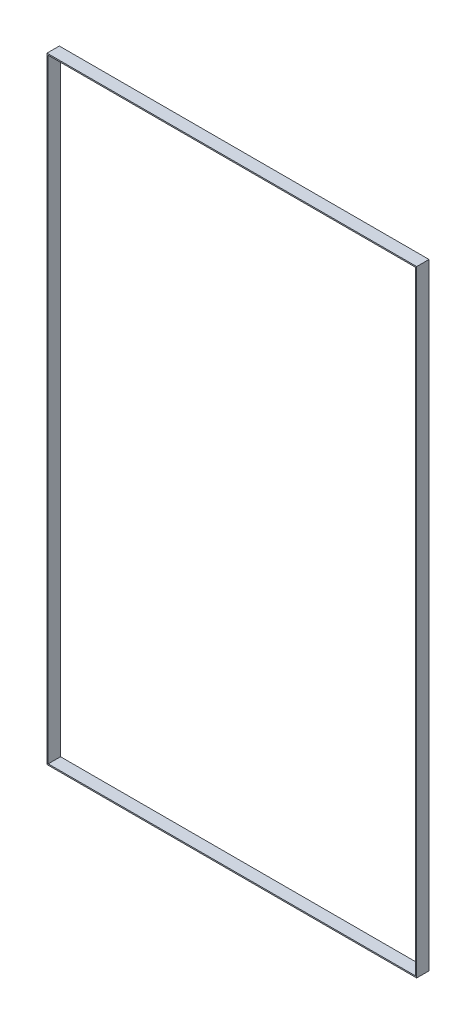
ISO-10303-21;
HEADER;
FILE_DESCRIPTION(('STEP AP214'),'2;1');
FILE_NAME('part.step','',(''),(''),'','','');
FILE_SCHEMA(('AUTOMOTIVE_DESIGN { 1 0 10303 214 1 1 1 1 }'));
ENDSEC;
DATA;
#1=APPLICATION_CONTEXT('core data for automotive mechanical design processes');
#2=APPLICATION_PROTOCOL_DEFINITION('international standard','automotive_design',2000,#1);
#3=PRODUCT_CONTEXT('',#1,'mechanical');
#4=PRODUCT('Part','Part','',(#3));
#5=PRODUCT_RELATED_PRODUCT_CATEGORY('part','',(#4));
#6=PRODUCT_DEFINITION_FORMATION('','',#4);
#7=PRODUCT_DEFINITION_CONTEXT('part definition',#1,'design');
#8=PRODUCT_DEFINITION('design','',#6,#7);
#9=PRODUCT_DEFINITION_SHAPE('','',#8);
#10=(LENGTH_UNIT() NAMED_UNIT(*) SI_UNIT(.MILLI.,.METRE.));
#11=(NAMED_UNIT(*) PLANE_ANGLE_UNIT() SI_UNIT($,.RADIAN.));
#12=(NAMED_UNIT(*) SI_UNIT($,.STERADIAN.) SOLID_ANGLE_UNIT());
#13=UNCERTAINTY_MEASURE_WITH_UNIT(LENGTH_MEASURE(1.E-05),#10,'distance_accuracy_value','');
#14=(GEOMETRIC_REPRESENTATION_CONTEXT(3) GLOBAL_UNCERTAINTY_ASSIGNED_CONTEXT((#13)) GLOBAL_UNIT_ASSIGNED_CONTEXT((#10,
#11,#12)) REPRESENTATION_CONTEXT('',''));
#15=CARTESIAN_POINT('',(0.,0.,0.));
#16=DIRECTION('',(0.,0.,1.));
#17=DIRECTION('',(1.,0.,0.));
#18=AXIS2_PLACEMENT_3D('',#15,#16,#17);
#19=CARTESIAN_POINT('',(0.,0.,20.));
#20=DIRECTION('',(0.,0.,1.));
#21=DIRECTION('',(1.,0.,0.));
#22=AXIS2_PLACEMENT_3D('',#19,#20,#21);
#23=PLANE('',#22);
#24=DIRECTION('',(0.,-1.,0.));
#25=VECTOR('',#24,1.);
#26=CARTESIAN_POINT('',(-300.,-500.,20.));
#27=LINE('',#26,#25);
#28=CARTESIAN_POINT('',(-300.,500.,20.));
#29=VERTEX_POINT('',#28);
#30=CARTESIAN_POINT('',(-300.,-500.,20.));
#31=VERTEX_POINT('',#30);
#32=EDGE_CURVE('E134',#29,#31,#27,.T.);
#33=ORIENTED_EDGE('',*,*,#32,.T.);
#34=DIRECTION('',(1.,0.,0.));
#35=VECTOR('',#34,1.);
#36=CARTESIAN_POINT('',(300.,-500.,20.));
#37=LINE('',#36,#35);
#38=CARTESIAN_POINT('',(300.,-500.,20.));
#39=VERTEX_POINT('',#38);
#40=EDGE_CURVE('E137',#31,#39,#37,.T.);
#41=ORIENTED_EDGE('',*,*,#40,.T.);
#42=DIRECTION('',(0.,1.,0.));
#43=VECTOR('',#42,1.);
#44=CARTESIAN_POINT('',(300.,-500.,20.));
#45=LINE('',#44,#43);
#46=CARTESIAN_POINT('',(300.,500.,20.));
#47=VERTEX_POINT('',#46);
#48=EDGE_CURVE('E140',#39,#47,#45,.T.);
#49=ORIENTED_EDGE('',*,*,#48,.T.);
#50=DIRECTION('',(-1.,0.,0.));
#51=VECTOR('',#50,1.);
#52=CARTESIAN_POINT('',(300.,500.,20.));
#53=LINE('',#52,#51);
#54=EDGE_CURVE('E142',#47,#29,#53,.T.);
#55=ORIENTED_EDGE('',*,*,#54,.T.);
#56=EDGE_LOOP('',(#33,#41,#49,#55));
#57=FACE_BOUND('',#56,.T.);
#58=DIRECTION('',(1.,0.,0.));
#59=VECTOR('',#58,1.);
#60=CARTESIAN_POINT('',(298.,-498.,20.));
#61=LINE('',#60,#59);
#62=CARTESIAN_POINT('',(-298.,-498.,20.));
#63=VERTEX_POINT('',#62);
#64=CARTESIAN_POINT('',(298.,-498.,20.));
#65=VERTEX_POINT('',#64);
#66=EDGE_CURVE('E106',#63,#65,#61,.T.);
#67=ORIENTED_EDGE('',*,*,#66,.F.);
#68=DIRECTION('',(0.,-1.,0.));
#69=VECTOR('',#68,1.);
#70=CARTESIAN_POINT('',(-298.,-498.,20.));
#71=LINE('',#70,#69);
#72=CARTESIAN_POINT('',(-298.,498.,20.));
#73=VERTEX_POINT('',#72);
#74=EDGE_CURVE('E98',#73,#63,#71,.T.);
#75=ORIENTED_EDGE('',*,*,#74,.F.);
#76=DIRECTION('',(-1.,0.,0.));
#77=VECTOR('',#76,1.);
#78=CARTESIAN_POINT('',(298.,498.,20.));
#79=LINE('',#78,#77);
#80=CARTESIAN_POINT('',(298.,498.,20.));
#81=VERTEX_POINT('',#80);
#82=EDGE_CURVE('E120',#81,#73,#79,.T.);
#83=ORIENTED_EDGE('',*,*,#82,.F.);
#84=DIRECTION('',(0.,1.,0.));
#85=VECTOR('',#84,1.);
#86=CARTESIAN_POINT('',(298.,-498.,20.));
#87=LINE('',#86,#85);
#88=EDGE_CURVE('E118',#65,#81,#87,.T.);
#89=ORIENTED_EDGE('',*,*,#88,.F.);
#90=EDGE_LOOP('',(#67,#75,#83,#89));
#91=FACE_BOUND('',#90,.T.);
#92=ADVANCED_FACE('F33',(#57,#91),#23,.T.);
#93=CARTESIAN_POINT('',(0.,0.,0.));
#94=DIRECTION('',(0.,0.,1.));
#95=DIRECTION('',(1.,0.,0.));
#96=AXIS2_PLACEMENT_3D('',#93,#94,#95);
#97=PLANE('',#96);
#98=DIRECTION('',(0.,-1.,0.));
#99=VECTOR('',#98,1.);
#100=CARTESIAN_POINT('',(-300.,-500.,0.));
#101=LINE('',#100,#99);
#102=CARTESIAN_POINT('',(-300.,500.,0.));
#103=VERTEX_POINT('',#102);
#104=CARTESIAN_POINT('',(-300.,-500.,0.));
#105=VERTEX_POINT('',#104);
#106=EDGE_CURVE('E114',#103,#105,#101,.T.);
#107=ORIENTED_EDGE('',*,*,#106,.F.);
#108=DIRECTION('',(-1.,0.,0.));
#109=VECTOR('',#108,1.);
#110=CARTESIAN_POINT('',(300.,500.,0.));
#111=LINE('',#110,#109);
#112=CARTESIAN_POINT('',(300.,500.,0.));
#113=VERTEX_POINT('',#112);
#114=EDGE_CURVE('E138',#113,#103,#111,.T.);
#115=ORIENTED_EDGE('',*,*,#114,.F.);
#116=DIRECTION('',(0.,1.,0.));
#117=VECTOR('',#116,1.);
#118=CARTESIAN_POINT('',(300.,-500.,0.));
#119=LINE('',#118,#117);
#120=CARTESIAN_POINT('',(300.,-500.,0.));
#121=VERTEX_POINT('',#120);
#122=EDGE_CURVE('E149',#121,#113,#119,.T.);
#123=ORIENTED_EDGE('',*,*,#122,.F.);
#124=DIRECTION('',(1.,0.,0.));
#125=VECTOR('',#124,1.);
#126=CARTESIAN_POINT('',(300.,-500.,0.));
#127=LINE('',#126,#125);
#128=EDGE_CURVE('E147',#105,#121,#127,.T.);
#129=ORIENTED_EDGE('',*,*,#128,.F.);
#130=EDGE_LOOP('',(#107,#115,#123,#129));
#131=FACE_BOUND('',#130,.T.);
#132=DIRECTION('',(0.,-1.,0.));
#133=VECTOR('',#132,1.);
#134=CARTESIAN_POINT('',(-298.,-498.,0.));
#135=LINE('',#134,#133);
#136=CARTESIAN_POINT('',(-298.,498.,0.));
#137=VERTEX_POINT('',#136);
#138=CARTESIAN_POINT('',(-298.,-498.,0.));
#139=VERTEX_POINT('',#138);
#140=EDGE_CURVE('E56',#137,#139,#135,.T.);
#141=ORIENTED_EDGE('',*,*,#140,.T.);
#142=DIRECTION('',(1.,0.,0.));
#143=VECTOR('',#142,1.);
#144=CARTESIAN_POINT('',(298.,-498.,0.));
#145=LINE('',#144,#143);
#146=CARTESIAN_POINT('',(298.,-498.,0.));
#147=VERTEX_POINT('',#146);
#148=EDGE_CURVE('E113',#139,#147,#145,.T.);
#149=ORIENTED_EDGE('',*,*,#148,.T.);
#150=DIRECTION('',(0.,1.,0.));
#151=VECTOR('',#150,1.);
#152=CARTESIAN_POINT('',(298.,-498.,0.));
#153=LINE('',#152,#151);
#154=CARTESIAN_POINT('',(298.,498.,0.));
#155=VERTEX_POINT('',#154);
#156=EDGE_CURVE('E126',#147,#155,#153,.T.);
#157=ORIENTED_EDGE('',*,*,#156,.T.);
#158=DIRECTION('',(-1.,0.,0.));
#159=VECTOR('',#158,1.);
#160=CARTESIAN_POINT('',(298.,498.,0.));
#161=LINE('',#160,#159);
#162=EDGE_CURVE('E107',#155,#137,#161,.T.);
#163=ORIENTED_EDGE('',*,*,#162,.T.);
#164=EDGE_LOOP('',(#141,#149,#157,#163));
#165=FACE_BOUND('',#164,.T.);
#166=ADVANCED_FACE('F167',(#131,#165),#97,.F.);
#167=CARTESIAN_POINT('',(-300.,-500.,20.));
#168=DIRECTION('',(1.,0.,0.));
#169=DIRECTION('',(0.,0.,-1.));
#170=AXIS2_PLACEMENT_3D('',#167,#168,#169);
#171=PLANE('',#170);
#172=ORIENTED_EDGE('',*,*,#106,.T.);
#173=DIRECTION('',(0.,0.,-1.));
#174=VECTOR('',#173,1.);
#175=CARTESIAN_POINT('',(-300.,-500.,20.));
#176=LINE('',#175,#174);
#177=EDGE_CURVE('E11',#31,#105,#176,.T.);
#178=ORIENTED_EDGE('',*,*,#177,.F.);
#179=ORIENTED_EDGE('',*,*,#32,.F.);
#180=DIRECTION('',(0.,0.,-1.));
#181=VECTOR('',#180,1.);
#182=CARTESIAN_POINT('',(-300.,500.,20.));
#183=LINE('',#182,#181);
#184=EDGE_CURVE('E144',#29,#103,#183,.T.);
#185=ORIENTED_EDGE('',*,*,#184,.T.);
#186=EDGE_LOOP('',(#172,#178,#179,#185));
#187=FACE_BOUND('',#186,.T.);
#188=ADVANCED_FACE('F35',(#187),#171,.F.);
#189=CARTESIAN_POINT('',(300.,-500.,20.));
#190=DIRECTION('',(0.,1.,0.));
#191=DIRECTION('',(-1.,0.,0.));
#192=AXIS2_PLACEMENT_3D('',#189,#190,#191);
#193=PLANE('',#192);
#194=ORIENTED_EDGE('',*,*,#128,.T.);
#195=DIRECTION('',(0.,0.,-1.));
#196=VECTOR('',#195,1.);
#197=CARTESIAN_POINT('',(300.,-500.,20.));
#198=LINE('',#197,#196);
#199=EDGE_CURVE('E41',#39,#121,#198,.T.);
#200=ORIENTED_EDGE('',*,*,#199,.F.);
#201=ORIENTED_EDGE('',*,*,#40,.F.);
#202=ORIENTED_EDGE('',*,*,#177,.T.);
#203=EDGE_LOOP('',(#194,#200,#201,#202));
#204=FACE_BOUND('',#203,.T.);
#205=ADVANCED_FACE('F177',(#204),#193,.F.);
#206=CARTESIAN_POINT('',(300.,-500.,20.));
#207=DIRECTION('',(-1.,0.,0.));
#208=DIRECTION('',(0.,0.,1.));
#209=AXIS2_PLACEMENT_3D('',#206,#207,#208);
#210=PLANE('',#209);
#211=ORIENTED_EDGE('',*,*,#122,.T.);
#212=DIRECTION('',(0.,0.,-1.));
#213=VECTOR('',#212,1.);
#214=CARTESIAN_POINT('',(300.,500.,20.));
#215=LINE('',#214,#213);
#216=EDGE_CURVE('E154',#47,#113,#215,.T.);
#217=ORIENTED_EDGE('',*,*,#216,.F.);
#218=ORIENTED_EDGE('',*,*,#48,.F.);
#219=ORIENTED_EDGE('',*,*,#199,.T.);
#220=EDGE_LOOP('',(#211,#217,#218,#219));
#221=FACE_BOUND('',#220,.T.);
#222=ADVANCED_FACE('F161',(#221),#210,.F.);
#223=CARTESIAN_POINT('',(300.,500.,20.));
#224=DIRECTION('',(0.,-1.,0.));
#225=DIRECTION('',(1.,0.,0.));
#226=AXIS2_PLACEMENT_3D('',#223,#224,#225);
#227=PLANE('',#226);
#228=ORIENTED_EDGE('',*,*,#114,.T.);
#229=ORIENTED_EDGE('',*,*,#184,.F.);
#230=ORIENTED_EDGE('',*,*,#54,.F.);
#231=ORIENTED_EDGE('',*,*,#216,.T.);
#232=EDGE_LOOP('',(#228,#229,#230,#231));
#233=FACE_BOUND('',#232,.T.);
#234=ADVANCED_FACE('F171',(#233),#227,.F.);
#235=CARTESIAN_POINT('',(-298.,-498.,20.));
#236=DIRECTION('',(1.,0.,0.));
#237=DIRECTION('',(0.,0.,-1.));
#238=AXIS2_PLACEMENT_3D('',#235,#236,#237);
#239=PLANE('',#238);
#240=ORIENTED_EDGE('',*,*,#140,.F.);
#241=DIRECTION('',(0.,0.,-1.));
#242=VECTOR('',#241,1.);
#243=CARTESIAN_POINT('',(-298.,498.,20.));
#244=LINE('',#243,#242);
#245=EDGE_CURVE('E102',#73,#137,#244,.T.);
#246=ORIENTED_EDGE('',*,*,#245,.F.);
#247=ORIENTED_EDGE('',*,*,#74,.T.);
#248=DIRECTION('',(0.,0.,-1.));
#249=VECTOR('',#248,1.);
#250=CARTESIAN_POINT('',(-298.,-498.,20.));
#251=LINE('',#250,#249);
#252=EDGE_CURVE('E101',#63,#139,#251,.T.);
#253=ORIENTED_EDGE('',*,*,#252,.T.);
#254=EDGE_LOOP('',(#240,#246,#247,#253));
#255=FACE_BOUND('',#254,.T.);
#256=ADVANCED_FACE('F100',(#255),#239,.T.);
#257=CARTESIAN_POINT('',(298.,-498.,20.));
#258=DIRECTION('',(0.,1.,0.));
#259=DIRECTION('',(-1.,0.,0.));
#260=AXIS2_PLACEMENT_3D('',#257,#258,#259);
#261=PLANE('',#260);
#262=ORIENTED_EDGE('',*,*,#148,.F.);
#263=ORIENTED_EDGE('',*,*,#252,.F.);
#264=ORIENTED_EDGE('',*,*,#66,.T.);
#265=DIRECTION('',(0.,0.,-1.));
#266=VECTOR('',#265,1.);
#267=CARTESIAN_POINT('',(298.,-498.,20.));
#268=LINE('',#267,#266);
#269=EDGE_CURVE('E115',#65,#147,#268,.T.);
#270=ORIENTED_EDGE('',*,*,#269,.T.);
#271=EDGE_LOOP('',(#262,#263,#264,#270));
#272=FACE_BOUND('',#271,.T.);
#273=ADVANCED_FACE('F110',(#272),#261,.T.);
#274=CARTESIAN_POINT('',(298.,-498.,20.));
#275=DIRECTION('',(-1.,0.,0.));
#276=DIRECTION('',(0.,0.,1.));
#277=AXIS2_PLACEMENT_3D('',#274,#275,#276);
#278=PLANE('',#277);
#279=ORIENTED_EDGE('',*,*,#156,.F.);
#280=ORIENTED_EDGE('',*,*,#269,.F.);
#281=ORIENTED_EDGE('',*,*,#88,.T.);
#282=DIRECTION('',(0.,0.,-1.));
#283=VECTOR('',#282,1.);
#284=CARTESIAN_POINT('',(298.,498.,20.));
#285=LINE('',#284,#283);
#286=EDGE_CURVE('E48',#81,#155,#285,.T.);
#287=ORIENTED_EDGE('',*,*,#286,.T.);
#288=EDGE_LOOP('',(#279,#280,#281,#287));
#289=FACE_BOUND('',#288,.T.);
#290=ADVANCED_FACE('F200',(#289),#278,.T.);
#291=CARTESIAN_POINT('',(298.,498.,20.));
#292=DIRECTION('',(0.,-1.,0.));
#293=DIRECTION('',(1.,0.,0.));
#294=AXIS2_PLACEMENT_3D('',#291,#292,#293);
#295=PLANE('',#294);
#296=ORIENTED_EDGE('',*,*,#162,.F.);
#297=ORIENTED_EDGE('',*,*,#286,.F.);
#298=ORIENTED_EDGE('',*,*,#82,.T.);
#299=ORIENTED_EDGE('',*,*,#245,.T.);
#300=EDGE_LOOP('',(#296,#297,#298,#299));
#301=FACE_BOUND('',#300,.T.);
#302=ADVANCED_FACE('F204',(#301),#295,.T.);
#303=CLOSED_SHELL('',(#92,#166,#188,#205,#222,#234,#256,#273,#290,#302));
#304=MANIFOLD_SOLID_BREP('B2',#303);
#305=ADVANCED_BREP_SHAPE_REPRESENTATION('',(#18,#304),#14);
#306=SHAPE_DEFINITION_REPRESENTATION(#9,#305);
ENDSEC;
END-ISO-10303-21;
